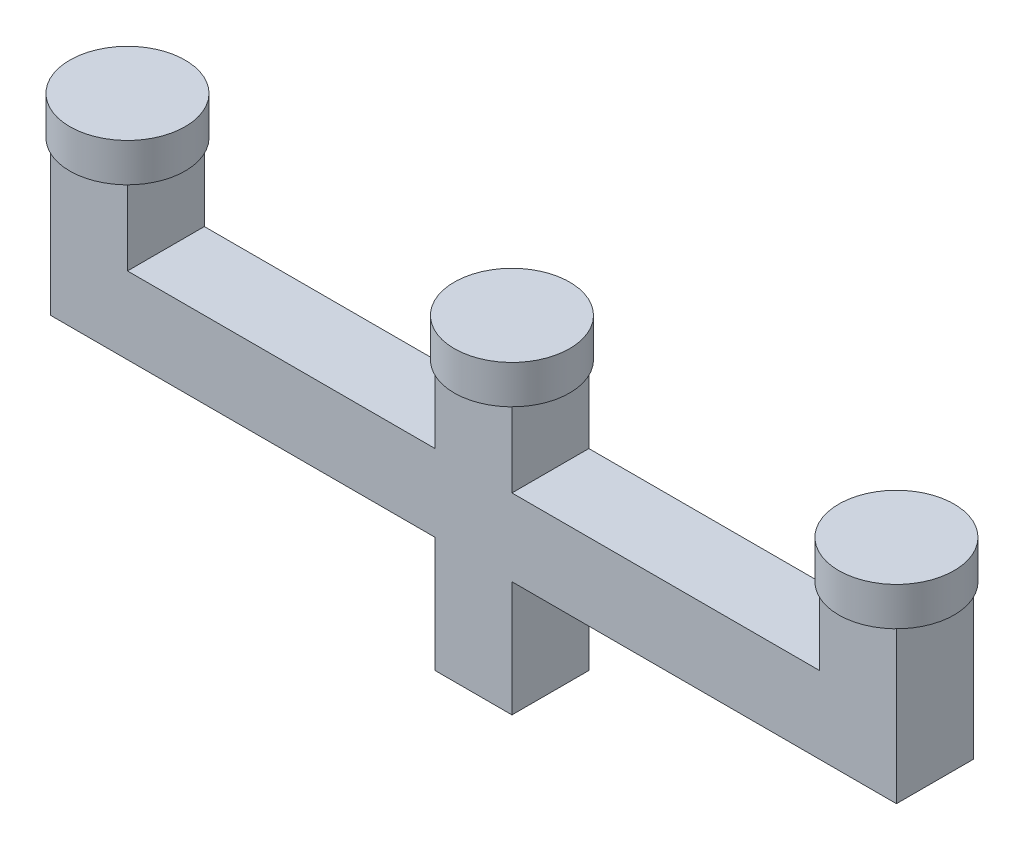
ISO-10303-21;
HEADER;
FILE_DESCRIPTION(('STEP AP214'),'2;1');
FILE_NAME('part.step','',(''),(''),'','','');
FILE_SCHEMA(('AUTOMOTIVE_DESIGN { 1 0 10303 214 1 1 1 1 }'));
ENDSEC;
DATA;
#1=APPLICATION_CONTEXT('core data for automotive mechanical design processes');
#2=APPLICATION_PROTOCOL_DEFINITION('international standard','automotive_design',2000,#1);
#3=PRODUCT_CONTEXT('',#1,'mechanical');
#4=PRODUCT('Part','Part','',(#3));
#5=PRODUCT_RELATED_PRODUCT_CATEGORY('part','',(#4));
#6=PRODUCT_DEFINITION_FORMATION('','',#4);
#7=PRODUCT_DEFINITION_CONTEXT('part definition',#1,'design');
#8=PRODUCT_DEFINITION('design','',#6,#7);
#9=PRODUCT_DEFINITION_SHAPE('','',#8);
#10=(LENGTH_UNIT() NAMED_UNIT(*) SI_UNIT(.MILLI.,.METRE.));
#11=(NAMED_UNIT(*) PLANE_ANGLE_UNIT() SI_UNIT($,.RADIAN.));
#12=(NAMED_UNIT(*) SI_UNIT($,.STERADIAN.) SOLID_ANGLE_UNIT());
#13=UNCERTAINTY_MEASURE_WITH_UNIT(LENGTH_MEASURE(1.E-05),#10,'distance_accuracy_value','');
#14=(GEOMETRIC_REPRESENTATION_CONTEXT(3) GLOBAL_UNCERTAINTY_ASSIGNED_CONTEXT((#13)) GLOBAL_UNIT_ASSIGNED_CONTEXT((#10,
#11,#12)) REPRESENTATION_CONTEXT('',''));
#15=CARTESIAN_POINT('',(0.,0.,0.));
#16=DIRECTION('',(0.,0.,1.));
#17=DIRECTION('',(1.,0.,0.));
#18=AXIS2_PLACEMENT_3D('',#15,#16,#17);
#19=CARTESIAN_POINT('',(110.,0.,20.));
#20=DIRECTION('',(0.,1.,0.));
#21=DIRECTION('',(-1.,0.,0.));
#22=AXIS2_PLACEMENT_3D('',#19,#20,#21);
#23=PLANE('',#22);
#24=DIRECTION('',(0.,0.,1.));
#25=VECTOR('',#24,1.);
#26=CARTESIAN_POINT('',(10.,0.,0.));
#27=LINE('',#26,#25);
#28=CARTESIAN_POINT('',(10.,0.,0.));
#29=VERTEX_POINT('',#28);
#30=CARTESIAN_POINT('',(10.,0.,20.));
#31=VERTEX_POINT('',#30);
#32=EDGE_CURVE('E285',#29,#31,#27,.T.);
#33=ORIENTED_EDGE('',*,*,#32,.F.);
#34=DIRECTION('',(1.,0.,0.));
#35=VECTOR('',#34,1.);
#36=CARTESIAN_POINT('',(110.,0.,0.));
#37=LINE('',#36,#35);
#38=CARTESIAN_POINT('',(110.,0.,0.));
#39=VERTEX_POINT('',#38);
#40=EDGE_CURVE('E158',#29,#39,#37,.T.);
#41=ORIENTED_EDGE('',*,*,#40,.T.);
#42=DIRECTION('',(0.,0.,-1.));
#43=VECTOR('',#42,1.);
#44=CARTESIAN_POINT('',(110.,0.,20.));
#45=LINE('',#44,#43);
#46=CARTESIAN_POINT('',(110.,0.,20.));
#47=VERTEX_POINT('',#46);
#48=EDGE_CURVE('E41',#47,#39,#45,.T.);
#49=ORIENTED_EDGE('',*,*,#48,.F.);
#50=DIRECTION('',(1.,0.,0.));
#51=VECTOR('',#50,1.);
#52=CARTESIAN_POINT('',(110.,0.,20.));
#53=LINE('',#52,#51);
#54=EDGE_CURVE('E292',#31,#47,#53,.T.);
#55=ORIENTED_EDGE('',*,*,#54,.F.);
#56=EDGE_LOOP('',(#33,#41,#49,#55));
#57=FACE_BOUND('',#56,.T.);
#58=ADVANCED_FACE('F33',(#57),#23,.F.);
#59=CARTESIAN_POINT('',(-110.,0.,20.));
#60=DIRECTION('',(1.,0.,0.));
#61=DIRECTION('',(0.,0.,-1.));
#62=AXIS2_PLACEMENT_3D('',#59,#60,#61);
#63=PLANE('',#62);
#64=DIRECTION('',(0.,-1.,0.));
#65=VECTOR('',#64,1.);
#66=CARTESIAN_POINT('',(-110.,0.,0.));
#67=LINE('',#66,#65);
#68=CARTESIAN_POINT('',(-110.,40.,0.));
#69=VERTEX_POINT('',#68);
#70=CARTESIAN_POINT('',(-110.,0.,0.));
#71=VERTEX_POINT('',#70);
#72=EDGE_CURVE('E155',#69,#71,#67,.T.);
#73=ORIENTED_EDGE('',*,*,#72,.T.);
#74=DIRECTION('',(0.,0.,-1.));
#75=VECTOR('',#74,1.);
#76=CARTESIAN_POINT('',(-110.,0.,20.));
#77=LINE('',#76,#75);
#78=CARTESIAN_POINT('',(-110.,0.,20.));
#79=VERTEX_POINT('',#78);
#80=EDGE_CURVE('E11',#79,#71,#77,.T.);
#81=ORIENTED_EDGE('',*,*,#80,.F.);
#82=DIRECTION('',(0.,-1.,0.));
#83=VECTOR('',#82,1.);
#84=CARTESIAN_POINT('',(-110.,0.,20.));
#85=LINE('',#84,#83);
#86=CARTESIAN_POINT('',(-110.,40.,20.));
#87=VERTEX_POINT('',#86);
#88=EDGE_CURVE('E184',#87,#79,#85,.T.);
#89=ORIENTED_EDGE('',*,*,#88,.F.);
#90=DIRECTION('',(0.,0.,-1.));
#91=VECTOR('',#90,1.);
#92=CARTESIAN_POINT('',(-110.,40.,20.));
#93=LINE('',#92,#91);
#94=EDGE_CURVE('E151',#87,#69,#93,.T.);
#95=ORIENTED_EDGE('',*,*,#94,.T.);
#96=EDGE_LOOP('',(#73,#81,#89,#95));
#97=FACE_BOUND('',#96,.T.);
#98=ADVANCED_FACE('F35',(#97),#63,.F.);
#99=CARTESIAN_POINT('',(-10.,0.,0.));
#100=VERTEX_POINT('',#99);
#101=EDGE_CURVE('E160',#71,#100,#37,.T.);
#102=ORIENTED_EDGE('',*,*,#101,.T.);
#103=DIRECTION('',(0.,0.,1.));
#104=VECTOR('',#103,1.);
#105=CARTESIAN_POINT('',(-10.,0.,0.));
#106=LINE('',#105,#104);
#107=CARTESIAN_POINT('',(-10.,0.,20.));
#108=VERTEX_POINT('',#107);
#109=EDGE_CURVE('E159',#100,#108,#106,.T.);
#110=ORIENTED_EDGE('',*,*,#109,.T.);
#111=EDGE_CURVE('E101',#79,#108,#53,.T.);
#112=ORIENTED_EDGE('',*,*,#111,.F.);
#113=ORIENTED_EDGE('',*,*,#80,.T.);
#114=EDGE_LOOP('',(#102,#110,#112,#113));
#115=FACE_BOUND('',#114,.T.);
#116=ADVANCED_FACE('F347',(#115),#23,.F.);
#117=CARTESIAN_POINT('',(110.,0.,20.));
#118=DIRECTION('',(-1.,0.,0.));
#119=DIRECTION('',(0.,0.,1.));
#120=AXIS2_PLACEMENT_3D('',#117,#118,#119);
#121=PLANE('',#120);
#122=DIRECTION('',(0.,1.,0.));
#123=VECTOR('',#122,1.);
#124=CARTESIAN_POINT('',(110.,0.,0.));
#125=LINE('',#124,#123);
#126=CARTESIAN_POINT('',(110.,40.,0.));
#127=VERTEX_POINT('',#126);
#128=EDGE_CURVE('E163',#39,#127,#125,.T.);
#129=ORIENTED_EDGE('',*,*,#128,.T.);
#130=DIRECTION('',(0.,0.,-1.));
#131=VECTOR('',#130,1.);
#132=CARTESIAN_POINT('',(110.,40.,20.));
#133=LINE('',#132,#131);
#134=CARTESIAN_POINT('',(110.,40.,20.));
#135=VERTEX_POINT('',#134);
#136=EDGE_CURVE('E204',#135,#127,#133,.T.);
#137=ORIENTED_EDGE('',*,*,#136,.F.);
#138=DIRECTION('',(0.,1.,0.));
#139=VECTOR('',#138,1.);
#140=CARTESIAN_POINT('',(110.,0.,20.));
#141=LINE('',#140,#139);
#142=EDGE_CURVE('E214',#47,#135,#141,.T.);
#143=ORIENTED_EDGE('',*,*,#142,.F.);
#144=ORIENTED_EDGE('',*,*,#48,.T.);
#145=EDGE_LOOP('',(#129,#137,#143,#144));
#146=FACE_BOUND('',#145,.T.);
#147=ADVANCED_FACE('F211',(#146),#121,.F.);
#148=CARTESIAN_POINT('',(90.,40.,20.));
#149=DIRECTION('',(1.,0.,0.));
#150=DIRECTION('',(0.,1.,0.));
#151=AXIS2_PLACEMENT_3D('',#148,#149,#150);
#152=PLANE('',#151);
#153=DIRECTION('',(0.,-1.,0.));
#154=VECTOR('',#153,1.);
#155=CARTESIAN_POINT('',(90.,40.,0.));
#156=LINE('',#155,#154);
#157=CARTESIAN_POINT('',(90.,40.,0.));
#158=VERTEX_POINT('',#157);
#159=CARTESIAN_POINT('',(90.,20.,0.));
#160=VERTEX_POINT('',#159);
#161=EDGE_CURVE('E168',#158,#160,#156,.T.);
#162=ORIENTED_EDGE('',*,*,#161,.T.);
#163=DIRECTION('',(0.,0.,-1.));
#164=VECTOR('',#163,1.);
#165=CARTESIAN_POINT('',(90.,20.,20.));
#166=LINE('',#165,#164);
#167=CARTESIAN_POINT('',(90.,20.,20.));
#168=VERTEX_POINT('',#167);
#169=EDGE_CURVE('E198',#168,#160,#166,.T.);
#170=ORIENTED_EDGE('',*,*,#169,.F.);
#171=DIRECTION('',(0.,-1.,0.));
#172=VECTOR('',#171,1.);
#173=CARTESIAN_POINT('',(90.,40.,20.));
#174=LINE('',#173,#172);
#175=CARTESIAN_POINT('',(90.,40.,20.));
#176=VERTEX_POINT('',#175);
#177=EDGE_CURVE('E232',#176,#168,#174,.T.);
#178=ORIENTED_EDGE('',*,*,#177,.F.);
#179=DIRECTION('',(0.,0.,-1.));
#180=VECTOR('',#179,1.);
#181=CARTESIAN_POINT('',(90.,40.,20.));
#182=LINE('',#181,#180);
#183=EDGE_CURVE('E201',#176,#158,#182,.T.);
#184=ORIENTED_EDGE('',*,*,#183,.T.);
#185=EDGE_LOOP('',(#162,#170,#178,#184));
#186=FACE_BOUND('',#185,.T.);
#187=ADVANCED_FACE('F356',(#186),#152,.F.);
#188=CARTESIAN_POINT('',(90.,20.,20.));
#189=DIRECTION('',(0.,-1.,0.));
#190=DIRECTION('',(0.,0.,-1.));
#191=AXIS2_PLACEMENT_3D('',#188,#189,#190);
#192=PLANE('',#191);
#193=DIRECTION('',(-1.,0.,0.));
#194=VECTOR('',#193,1.);
#195=CARTESIAN_POINT('',(90.,20.,0.));
#196=LINE('',#195,#194);
#197=CARTESIAN_POINT('',(9.99999999999998,20.,0.));
#198=VERTEX_POINT('',#197);
#199=EDGE_CURVE('E170',#160,#198,#196,.T.);
#200=ORIENTED_EDGE('',*,*,#199,.T.);
#201=DIRECTION('',(0.,0.,-1.));
#202=VECTOR('',#201,1.);
#203=CARTESIAN_POINT('',(9.99999999999998,20.,20.));
#204=LINE('',#203,#202);
#205=CARTESIAN_POINT('',(9.99999999999998,20.,20.));
#206=VERTEX_POINT('',#205);
#207=EDGE_CURVE('E195',#206,#198,#204,.T.);
#208=ORIENTED_EDGE('',*,*,#207,.F.);
#209=DIRECTION('',(-1.,0.,0.));
#210=VECTOR('',#209,1.);
#211=CARTESIAN_POINT('',(90.,20.,20.));
#212=LINE('',#211,#210);
#213=EDGE_CURVE('E234',#168,#206,#212,.T.);
#214=ORIENTED_EDGE('',*,*,#213,.F.);
#215=ORIENTED_EDGE('',*,*,#169,.T.);
#216=EDGE_LOOP('',(#200,#208,#214,#215));
#217=FACE_BOUND('',#216,.T.);
#218=ADVANCED_FACE('F388',(#217),#192,.F.);
#219=CARTESIAN_POINT('',(9.99999999999998,20.,20.));
#220=DIRECTION('',(-1.,0.,0.));
#221=DIRECTION('',(0.,-1.,0.));
#222=AXIS2_PLACEMENT_3D('',#219,#220,#221);
#223=PLANE('',#222);
#224=DIRECTION('',(0.,1.,0.));
#225=VECTOR('',#224,1.);
#226=CARTESIAN_POINT('',(9.99999999999998,20.,0.));
#227=LINE('',#226,#225);
#228=CARTESIAN_POINT('',(10.,40.,0.));
#229=VERTEX_POINT('',#228);
#230=EDGE_CURVE('E172',#198,#229,#227,.T.);
#231=ORIENTED_EDGE('',*,*,#230,.T.);
#232=DIRECTION('',(0.,0.,-1.));
#233=VECTOR('',#232,1.);
#234=CARTESIAN_POINT('',(10.,40.,20.));
#235=LINE('',#234,#233);
#236=CARTESIAN_POINT('',(10.,40.,20.));
#237=VERTEX_POINT('',#236);
#238=EDGE_CURVE('E192',#237,#229,#235,.T.);
#239=ORIENTED_EDGE('',*,*,#238,.F.);
#240=DIRECTION('',(0.,1.,0.));
#241=VECTOR('',#240,1.);
#242=CARTESIAN_POINT('',(9.99999999999998,20.,20.));
#243=LINE('',#242,#241);
#244=EDGE_CURVE('E240',#206,#237,#243,.T.);
#245=ORIENTED_EDGE('',*,*,#244,.F.);
#246=ORIENTED_EDGE('',*,*,#207,.T.);
#247=EDGE_LOOP('',(#231,#239,#245,#246));
#248=FACE_BOUND('',#247,.T.);
#249=ADVANCED_FACE('F385',(#248),#223,.F.);
#250=CARTESIAN_POINT('',(-9.99999999999998,20.,20.));
#251=DIRECTION('',(1.,0.,0.));
#252=DIRECTION('',(0.,1.,0.));
#253=AXIS2_PLACEMENT_3D('',#250,#251,#252);
#254=PLANE('',#253);
#255=DIRECTION('',(0.,-1.,0.));
#256=VECTOR('',#255,1.);
#257=CARTESIAN_POINT('',(-9.99999999999998,20.,0.));
#258=LINE('',#257,#256);
#259=CARTESIAN_POINT('',(-9.99999999999999,40.,0.));
#260=VERTEX_POINT('',#259);
#261=CARTESIAN_POINT('',(-9.99999999999998,20.,0.));
#262=VERTEX_POINT('',#261);
#263=EDGE_CURVE('E177',#260,#262,#258,.T.);
#264=ORIENTED_EDGE('',*,*,#263,.T.);
#265=DIRECTION('',(0.,0.,-1.));
#266=VECTOR('',#265,1.);
#267=CARTESIAN_POINT('',(-9.99999999999998,20.,20.));
#268=LINE('',#267,#266);
#269=CARTESIAN_POINT('',(-9.99999999999998,20.,20.));
#270=VERTEX_POINT('',#269);
#271=EDGE_CURVE('E145',#270,#262,#268,.T.);
#272=ORIENTED_EDGE('',*,*,#271,.F.);
#273=DIRECTION('',(0.,-1.,0.));
#274=VECTOR('',#273,1.);
#275=CARTESIAN_POINT('',(-9.99999999999998,20.,20.));
#276=LINE('',#275,#274);
#277=CARTESIAN_POINT('',(-9.99999999999999,40.,20.));
#278=VERTEX_POINT('',#277);
#279=EDGE_CURVE('E136',#278,#270,#276,.T.);
#280=ORIENTED_EDGE('',*,*,#279,.F.);
#281=DIRECTION('',(0.,0.,-1.));
#282=VECTOR('',#281,1.);
#283=CARTESIAN_POINT('',(-9.99999999999999,40.,20.));
#284=LINE('',#283,#282);
#285=EDGE_CURVE('E189',#278,#260,#284,.T.);
#286=ORIENTED_EDGE('',*,*,#285,.T.);
#287=EDGE_LOOP('',(#264,#272,#280,#286));
#288=FACE_BOUND('',#287,.T.);
#289=ADVANCED_FACE('F249',(#288),#254,.F.);
#290=CARTESIAN_POINT('',(-90.,20.,20.));
#291=DIRECTION('',(0.,-1.,0.));
#292=DIRECTION('',(0.,0.,-1.));
#293=AXIS2_PLACEMENT_3D('',#290,#291,#292);
#294=PLANE('',#293);
#295=DIRECTION('',(-1.,0.,0.));
#296=VECTOR('',#295,1.);
#297=CARTESIAN_POINT('',(-90.,20.,0.));
#298=LINE('',#297,#296);
#299=CARTESIAN_POINT('',(-90.,20.,0.));
#300=VERTEX_POINT('',#299);
#301=EDGE_CURVE('E144',#262,#300,#298,.T.);
#302=ORIENTED_EDGE('',*,*,#301,.T.);
#303=DIRECTION('',(0.,0.,-1.));
#304=VECTOR('',#303,1.);
#305=CARTESIAN_POINT('',(-90.,20.,20.));
#306=LINE('',#305,#304);
#307=CARTESIAN_POINT('',(-90.,20.,20.));
#308=VERTEX_POINT('',#307);
#309=EDGE_CURVE('E141',#308,#300,#306,.T.);
#310=ORIENTED_EDGE('',*,*,#309,.F.);
#311=DIRECTION('',(-1.,0.,0.));
#312=VECTOR('',#311,1.);
#313=CARTESIAN_POINT('',(-90.,20.,20.));
#314=LINE('',#313,#312);
#315=EDGE_CURVE('E130',#270,#308,#314,.T.);
#316=ORIENTED_EDGE('',*,*,#315,.F.);
#317=ORIENTED_EDGE('',*,*,#271,.T.);
#318=EDGE_LOOP('',(#302,#310,#316,#317));
#319=FACE_BOUND('',#318,.T.);
#320=ADVANCED_FACE('F142',(#319),#294,.F.);
#321=CARTESIAN_POINT('',(-90.,40.,20.));
#322=DIRECTION('',(-1.,0.,0.));
#323=DIRECTION('',(0.,-1.,0.));
#324=AXIS2_PLACEMENT_3D('',#321,#322,#323);
#325=PLANE('',#324);
#326=DIRECTION('',(0.,1.,0.));
#327=VECTOR('',#326,1.);
#328=CARTESIAN_POINT('',(-90.,40.,0.));
#329=LINE('',#328,#327);
#330=CARTESIAN_POINT('',(-90.,40.,0.));
#331=VERTEX_POINT('',#330);
#332=EDGE_CURVE('E94',#300,#331,#329,.T.);
#333=ORIENTED_EDGE('',*,*,#332,.T.);
#334=DIRECTION('',(0.,0.,-1.));
#335=VECTOR('',#334,1.);
#336=CARTESIAN_POINT('',(-90.,40.,20.));
#337=LINE('',#336,#335);
#338=CARTESIAN_POINT('',(-90.,40.,20.));
#339=VERTEX_POINT('',#338);
#340=EDGE_CURVE('E146',#339,#331,#337,.T.);
#341=ORIENTED_EDGE('',*,*,#340,.F.);
#342=DIRECTION('',(0.,1.,0.));
#343=VECTOR('',#342,1.);
#344=CARTESIAN_POINT('',(-90.,40.,20.));
#345=LINE('',#344,#343);
#346=EDGE_CURVE('E134',#308,#339,#345,.T.);
#347=ORIENTED_EDGE('',*,*,#346,.F.);
#348=ORIENTED_EDGE('',*,*,#309,.T.);
#349=EDGE_LOOP('',(#333,#341,#347,#348));
#350=FACE_BOUND('',#349,.T.);
#351=ADVANCED_FACE('F148',(#350),#325,.F.);
#352=CARTESIAN_POINT('',(0.,0.,20.));
#353=DIRECTION('',(0.,0.,-1.));
#354=DIRECTION('',(-1.,0.,0.));
#355=AXIS2_PLACEMENT_3D('',#352,#353,#354);
#356=PLANE('',#355);
#357=ORIENTED_EDGE('',*,*,#88,.T.);
#358=ORIENTED_EDGE('',*,*,#111,.T.);
#359=DIRECTION('',(0.,-1.,0.));
#360=VECTOR('',#359,1.);
#361=CARTESIAN_POINT('',(-10.,0.,20.));
#362=LINE('',#361,#360);
#363=CARTESIAN_POINT('',(-10.,-30.,20.));
#364=VERTEX_POINT('',#363);
#365=EDGE_CURVE('E48',#108,#364,#362,.T.);
#366=ORIENTED_EDGE('',*,*,#365,.T.);
#367=DIRECTION('',(1.,0.,0.));
#368=VECTOR('',#367,1.);
#369=CARTESIAN_POINT('',(-10.,-30.,20.));
#370=LINE('',#369,#368);
#371=CARTESIAN_POINT('',(9.99999999999999,-30.,20.));
#372=VERTEX_POINT('',#371);
#373=EDGE_CURVE('E293',#364,#372,#370,.T.);
#374=ORIENTED_EDGE('',*,*,#373,.T.);
#375=DIRECTION('',(0.,1.,0.));
#376=VECTOR('',#375,1.);
#377=CARTESIAN_POINT('',(10.,0.,20.));
#378=LINE('',#377,#376);
#379=EDGE_CURVE('E288',#372,#31,#378,.T.);
#380=ORIENTED_EDGE('',*,*,#379,.T.);
#381=ORIENTED_EDGE('',*,*,#54,.T.);
#382=ORIENTED_EDGE('',*,*,#142,.T.);
#383=DIRECTION('',(-1.,0.,0.));
#384=VECTOR('',#383,1.);
#385=CARTESIAN_POINT('',(110.,40.,20.));
#386=LINE('',#385,#384);
#387=EDGE_CURVE('E230',#135,#176,#386,.T.);
#388=ORIENTED_EDGE('',*,*,#387,.T.);
#389=ORIENTED_EDGE('',*,*,#177,.T.);
#390=ORIENTED_EDGE('',*,*,#213,.T.);
#391=ORIENTED_EDGE('',*,*,#244,.T.);
#392=DIRECTION('',(-1.,0.,0.));
#393=VECTOR('',#392,1.);
#394=CARTESIAN_POINT('',(-9.99999999999999,40.,20.));
#395=LINE('',#394,#393);
#396=EDGE_CURVE('E242',#237,#278,#395,.T.);
#397=ORIENTED_EDGE('',*,*,#396,.T.);
#398=ORIENTED_EDGE('',*,*,#279,.T.);
#399=ORIENTED_EDGE('',*,*,#315,.T.);
#400=ORIENTED_EDGE('',*,*,#346,.T.);
#401=DIRECTION('',(-1.,0.,0.));
#402=VECTOR('',#401,1.);
#403=CARTESIAN_POINT('',(-110.,40.,20.));
#404=LINE('',#403,#402);
#405=EDGE_CURVE('E57',#339,#87,#404,.T.);
#406=ORIENTED_EDGE('',*,*,#405,.T.);
#407=EDGE_LOOP('',(#357,#358,#366,#374,#380,#381,#382,#388,#389,#390,#391,#397,#398,#399,#400,#406));
#408=FACE_BOUND('',#407,.T.);
#409=ADVANCED_FACE('F132',(#408),#356,.F.);
#410=CARTESIAN_POINT('',(0.,0.,0.));
#411=DIRECTION('',(0.,0.,-1.));
#412=DIRECTION('',(-1.,0.,0.));
#413=AXIS2_PLACEMENT_3D('',#410,#411,#412);
#414=PLANE('',#413);
#415=ORIENTED_EDGE('',*,*,#72,.F.);
#416=DIRECTION('',(-1.,0.,0.));
#417=VECTOR('',#416,1.);
#418=CARTESIAN_POINT('',(-110.,40.,0.));
#419=LINE('',#418,#417);
#420=EDGE_CURVE('E181',#331,#69,#419,.T.);
#421=ORIENTED_EDGE('',*,*,#420,.F.);
#422=ORIENTED_EDGE('',*,*,#332,.F.);
#423=ORIENTED_EDGE('',*,*,#301,.F.);
#424=ORIENTED_EDGE('',*,*,#263,.F.);
#425=DIRECTION('',(-1.,0.,0.));
#426=VECTOR('',#425,1.);
#427=CARTESIAN_POINT('',(-9.99999999999999,40.,0.));
#428=LINE('',#427,#426);
#429=EDGE_CURVE('E174',#229,#260,#428,.T.);
#430=ORIENTED_EDGE('',*,*,#429,.F.);
#431=ORIENTED_EDGE('',*,*,#230,.F.);
#432=ORIENTED_EDGE('',*,*,#199,.F.);
#433=ORIENTED_EDGE('',*,*,#161,.F.);
#434=DIRECTION('',(-1.,0.,0.));
#435=VECTOR('',#434,1.);
#436=CARTESIAN_POINT('',(110.,40.,0.));
#437=LINE('',#436,#435);
#438=EDGE_CURVE('E165',#127,#158,#437,.T.);
#439=ORIENTED_EDGE('',*,*,#438,.F.);
#440=ORIENTED_EDGE('',*,*,#128,.F.);
#441=ORIENTED_EDGE('',*,*,#40,.F.);
#442=DIRECTION('',(0.,1.,0.));
#443=VECTOR('',#442,1.);
#444=CARTESIAN_POINT('',(10.,0.,0.));
#445=LINE('',#444,#443);
#446=CARTESIAN_POINT('',(9.99999999999999,-30.,0.));
#447=VERTEX_POINT('',#446);
#448=EDGE_CURVE('E290',#447,#29,#445,.T.);
#449=ORIENTED_EDGE('',*,*,#448,.F.);
#450=DIRECTION('',(1.,0.,0.));
#451=VECTOR('',#450,1.);
#452=CARTESIAN_POINT('',(-10.,-30.,0.));
#453=LINE('',#452,#451);
#454=CARTESIAN_POINT('',(-10.,-30.,0.));
#455=VERTEX_POINT('',#454);
#456=EDGE_CURVE('E306',#455,#447,#453,.T.);
#457=ORIENTED_EDGE('',*,*,#456,.F.);
#458=DIRECTION('',(0.,-1.,0.));
#459=VECTOR('',#458,1.);
#460=CARTESIAN_POINT('',(-10.,0.,0.));
#461=LINE('',#460,#459);
#462=EDGE_CURVE('E294',#100,#455,#461,.T.);
#463=ORIENTED_EDGE('',*,*,#462,.F.);
#464=ORIENTED_EDGE('',*,*,#101,.F.);
#465=EDGE_LOOP('',(#415,#421,#422,#423,#424,#430,#431,#432,#433,#439,#440,#441,#449,#457,#463,#464));
#466=FACE_BOUND('',#465,.T.);
#467=ADVANCED_FACE('F220',(#466),#414,.T.);
#468=CARTESIAN_POINT('',(-10.,0.,0.));
#469=DIRECTION('',(-1.,0.,0.));
#470=DIRECTION('',(0.,-1.,0.));
#471=AXIS2_PLACEMENT_3D('',#468,#469,#470);
#472=PLANE('',#471);
#473=ORIENTED_EDGE('',*,*,#365,.F.);
#474=ORIENTED_EDGE('',*,*,#109,.F.);
#475=ORIENTED_EDGE('',*,*,#462,.T.);
#476=DIRECTION('',(0.,0.,1.));
#477=VECTOR('',#476,1.);
#478=CARTESIAN_POINT('',(-10.,-30.,0.));
#479=LINE('',#478,#477);
#480=EDGE_CURVE('E298',#455,#364,#479,.T.);
#481=ORIENTED_EDGE('',*,*,#480,.T.);
#482=EDGE_LOOP('',(#473,#474,#475,#481));
#483=FACE_BOUND('',#482,.T.);
#484=ADVANCED_FACE('F359',(#483),#472,.T.);
#485=CARTESIAN_POINT('',(10.,0.,0.));
#486=DIRECTION('',(1.,0.,0.));
#487=DIRECTION('',(0.,1.,0.));
#488=AXIS2_PLACEMENT_3D('',#485,#486,#487);
#489=PLANE('',#488);
#490=ORIENTED_EDGE('',*,*,#379,.F.);
#491=DIRECTION('',(0.,0.,1.));
#492=VECTOR('',#491,1.);
#493=CARTESIAN_POINT('',(9.99999999999999,-30.,0.));
#494=LINE('',#493,#492);
#495=EDGE_CURVE('E280',#447,#372,#494,.T.);
#496=ORIENTED_EDGE('',*,*,#495,.F.);
#497=ORIENTED_EDGE('',*,*,#448,.T.);
#498=ORIENTED_EDGE('',*,*,#32,.T.);
#499=EDGE_LOOP('',(#490,#496,#497,#498));
#500=FACE_BOUND('',#499,.T.);
#501=ADVANCED_FACE('F287',(#500),#489,.T.);
#502=CARTESIAN_POINT('',(-10.,-30.,0.));
#503=DIRECTION('',(0.,-1.,0.));
#504=DIRECTION('',(0.,0.,-1.));
#505=AXIS2_PLACEMENT_3D('',#502,#503,#504);
#506=PLANE('',#505);
#507=ORIENTED_EDGE('',*,*,#373,.F.);
#508=ORIENTED_EDGE('',*,*,#480,.F.);
#509=ORIENTED_EDGE('',*,*,#456,.T.);
#510=ORIENTED_EDGE('',*,*,#495,.T.);
#511=EDGE_LOOP('',(#507,#508,#509,#510));
#512=FACE_BOUND('',#511,.T.);
#513=ADVANCED_FACE('F360',(#512),#506,.T.);
#514=CARTESIAN_POINT('',(0.,40.,10.));
#515=DIRECTION('',(0.,1.,0.));
#516=DIRECTION('',(0.,0.,1.));
#517=AXIS2_PLACEMENT_3D('',#514,#515,#516);
#518=PLANE('',#517);
#519=CARTESIAN_POINT('',(0.,40.,10.));
#520=DIRECTION('',(0.,1.,0.));
#521=DIRECTION('',(0.,0.,1.));
#522=AXIS2_PLACEMENT_3D('',#519,#520,#521);
#523=CIRCLE('',#522,15.);
#524=CARTESIAN_POINT('',(0.,40.,25.));
#525=VERTEX_POINT('',#524);
#526=EDGE_CURVE('E310',#525,#525,#523,.T.);
#527=ORIENTED_EDGE('',*,*,#526,.F.);
#528=EDGE_LOOP('',(#527));
#529=FACE_BOUND('',#528,.T.);
#530=ORIENTED_EDGE('',*,*,#285,.F.);
#531=ORIENTED_EDGE('',*,*,#396,.F.);
#532=ORIENTED_EDGE('',*,*,#238,.T.);
#533=ORIENTED_EDGE('',*,*,#429,.T.);
#534=EDGE_LOOP('',(#530,#531,#532,#533));
#535=FACE_BOUND('',#534,.T.);
#536=ADVANCED_FACE('F251',(#529,#535),#518,.F.);
#537=CARTESIAN_POINT('',(0.,50.,10.));
#538=DIRECTION('',(0.,-1.,0.));
#539=DIRECTION('',(0.,0.,-1.));
#540=AXIS2_PLACEMENT_3D('',#537,#538,#539);
#541=CYLINDRICAL_SURFACE('',#540,15.);
#542=CARTESIAN_POINT('',(0.,50.,10.));
#543=DIRECTION('',(0.,1.,0.));
#544=DIRECTION('',(0.,0.,1.));
#545=AXIS2_PLACEMENT_3D('',#542,#543,#544);
#546=CIRCLE('',#545,15.);
#547=CARTESIAN_POINT('',(0.,50.,25.));
#548=VERTEX_POINT('',#547);
#549=EDGE_CURVE('E304',#548,#548,#546,.T.);
#550=ORIENTED_EDGE('',*,*,#549,.F.);
#551=EDGE_LOOP('',(#550));
#552=FACE_BOUND('',#551,.T.);
#553=ORIENTED_EDGE('',*,*,#526,.T.);
#554=EDGE_LOOP('',(#553));
#555=FACE_BOUND('',#554,.T.);
#556=ADVANCED_FACE('F367',(#552,#555),#541,.T.);
#557=CARTESIAN_POINT('',(0.,50.,10.));
#558=DIRECTION('',(0.,1.,0.));
#559=DIRECTION('',(0.,0.,1.));
#560=AXIS2_PLACEMENT_3D('',#557,#558,#559);
#561=PLANE('',#560);
#562=ORIENTED_EDGE('',*,*,#549,.T.);
#563=EDGE_LOOP('',(#562));
#564=FACE_BOUND('',#563,.T.);
#565=ADVANCED_FACE('F499',(#564),#561,.T.);
#566=CARTESIAN_POINT('',(-100.,40.,10.));
#567=DIRECTION('',(0.,1.,0.));
#568=DIRECTION('',(0.,0.,1.));
#569=AXIS2_PLACEMENT_3D('',#566,#567,#568);
#570=PLANE('',#569);
#571=CARTESIAN_POINT('',(-100.,40.,10.));
#572=DIRECTION('',(0.,1.,0.));
#573=DIRECTION('',(0.,0.,1.));
#574=AXIS2_PLACEMENT_3D('',#571,#572,#573);
#575=CIRCLE('',#574,15.);
#576=CARTESIAN_POINT('',(-100.,40.,25.));
#577=VERTEX_POINT('',#576);
#578=EDGE_CURVE('E316',#577,#577,#575,.T.);
#579=ORIENTED_EDGE('',*,*,#578,.F.);
#580=EDGE_LOOP('',(#579));
#581=FACE_BOUND('',#580,.T.);
#582=ORIENTED_EDGE('',*,*,#94,.F.);
#583=ORIENTED_EDGE('',*,*,#405,.F.);
#584=ORIENTED_EDGE('',*,*,#340,.T.);
#585=ORIENTED_EDGE('',*,*,#420,.T.);
#586=EDGE_LOOP('',(#582,#583,#584,#585));
#587=FACE_BOUND('',#586,.T.);
#588=ADVANCED_FACE('F260',(#581,#587),#570,.F.);
#589=CARTESIAN_POINT('',(-100.,50.,10.));
#590=DIRECTION('',(0.,-1.,0.));
#591=DIRECTION('',(0.,0.,-1.));
#592=AXIS2_PLACEMENT_3D('',#589,#590,#591);
#593=CYLINDRICAL_SURFACE('',#592,15.);
#594=CARTESIAN_POINT('',(-100.,50.,10.));
#595=DIRECTION('',(0.,1.,0.));
#596=DIRECTION('',(0.,0.,1.));
#597=AXIS2_PLACEMENT_3D('',#594,#595,#596);
#598=CIRCLE('',#597,15.);
#599=CARTESIAN_POINT('',(-100.,50.,25.));
#600=VERTEX_POINT('',#599);
#601=EDGE_CURVE('E313',#600,#600,#598,.T.);
#602=ORIENTED_EDGE('',*,*,#601,.F.);
#603=EDGE_LOOP('',(#602));
#604=FACE_BOUND('',#603,.T.);
#605=ORIENTED_EDGE('',*,*,#578,.T.);
#606=EDGE_LOOP('',(#605));
#607=FACE_BOUND('',#606,.T.);
#608=ADVANCED_FACE('F342',(#604,#607),#593,.T.);
#609=CARTESIAN_POINT('',(-100.,50.,10.));
#610=DIRECTION('',(0.,1.,0.));
#611=DIRECTION('',(0.,0.,1.));
#612=AXIS2_PLACEMENT_3D('',#609,#610,#611);
#613=PLANE('',#612);
#614=ORIENTED_EDGE('',*,*,#601,.T.);
#615=EDGE_LOOP('',(#614));
#616=FACE_BOUND('',#615,.T.);
#617=ADVANCED_FACE('F337',(#616),#613,.T.);
#618=CARTESIAN_POINT('',(100.,40.,10.));
#619=DIRECTION('',(0.,1.,0.));
#620=DIRECTION('',(0.,0.,1.));
#621=AXIS2_PLACEMENT_3D('',#618,#619,#620);
#622=PLANE('',#621);
#623=CARTESIAN_POINT('',(100.,40.,10.));
#624=DIRECTION('',(0.,1.,0.));
#625=DIRECTION('',(0.,0.,1.));
#626=AXIS2_PLACEMENT_3D('',#623,#624,#625);
#627=CIRCLE('',#626,15.);
#628=CARTESIAN_POINT('',(100.,40.,25.));
#629=VERTEX_POINT('',#628);
#630=EDGE_CURVE('E322',#629,#629,#627,.T.);
#631=ORIENTED_EDGE('',*,*,#630,.F.);
#632=EDGE_LOOP('',(#631));
#633=FACE_BOUND('',#632,.T.);
#634=ORIENTED_EDGE('',*,*,#183,.F.);
#635=ORIENTED_EDGE('',*,*,#387,.F.);
#636=ORIENTED_EDGE('',*,*,#136,.T.);
#637=ORIENTED_EDGE('',*,*,#438,.T.);
#638=EDGE_LOOP('',(#634,#635,#636,#637));
#639=FACE_BOUND('',#638,.T.);
#640=ADVANCED_FACE('F229',(#633,#639),#622,.F.);
#641=CARTESIAN_POINT('',(100.,50.,10.));
#642=DIRECTION('',(0.,-1.,0.));
#643=DIRECTION('',(0.,0.,-1.));
#644=AXIS2_PLACEMENT_3D('',#641,#642,#643);
#645=CYLINDRICAL_SURFACE('',#644,15.);
#646=CARTESIAN_POINT('',(100.,50.,10.));
#647=DIRECTION('',(0.,1.,0.));
#648=DIRECTION('',(0.,0.,1.));
#649=AXIS2_PLACEMENT_3D('',#646,#647,#648);
#650=CIRCLE('',#649,15.);
#651=CARTESIAN_POINT('',(100.,50.,25.));
#652=VERTEX_POINT('',#651);
#653=EDGE_CURVE('E319',#652,#652,#650,.T.);
#654=ORIENTED_EDGE('',*,*,#653,.F.);
#655=EDGE_LOOP('',(#654));
#656=FACE_BOUND('',#655,.T.);
#657=ORIENTED_EDGE('',*,*,#630,.T.);
#658=EDGE_LOOP('',(#657));
#659=FACE_BOUND('',#658,.T.);
#660=ADVANCED_FACE('F330',(#656,#659),#645,.T.);
#661=CARTESIAN_POINT('',(100.,50.,10.));
#662=DIRECTION('',(0.,1.,0.));
#663=DIRECTION('',(0.,0.,1.));
#664=AXIS2_PLACEMENT_3D('',#661,#662,#663);
#665=PLANE('',#664);
#666=ORIENTED_EDGE('',*,*,#653,.T.);
#667=EDGE_LOOP('',(#666));
#668=FACE_BOUND('',#667,.T.);
#669=ADVANCED_FACE('F328',(#668),#665,.T.);
#670=CLOSED_SHELL('',(#58,#98,#116,#147,#187,#218,#249,#289,#320,#351,#409,#467,#484,#501,#513,
#536,#556,#565,#588,#608,#617,#640,#660,#669));
#671=MANIFOLD_SOLID_BREP('B2',#670);
#672=ADVANCED_BREP_SHAPE_REPRESENTATION('',(#18,#671),#14);
#673=SHAPE_DEFINITION_REPRESENTATION(#9,#672);
ENDSEC;
END-ISO-10303-21;
